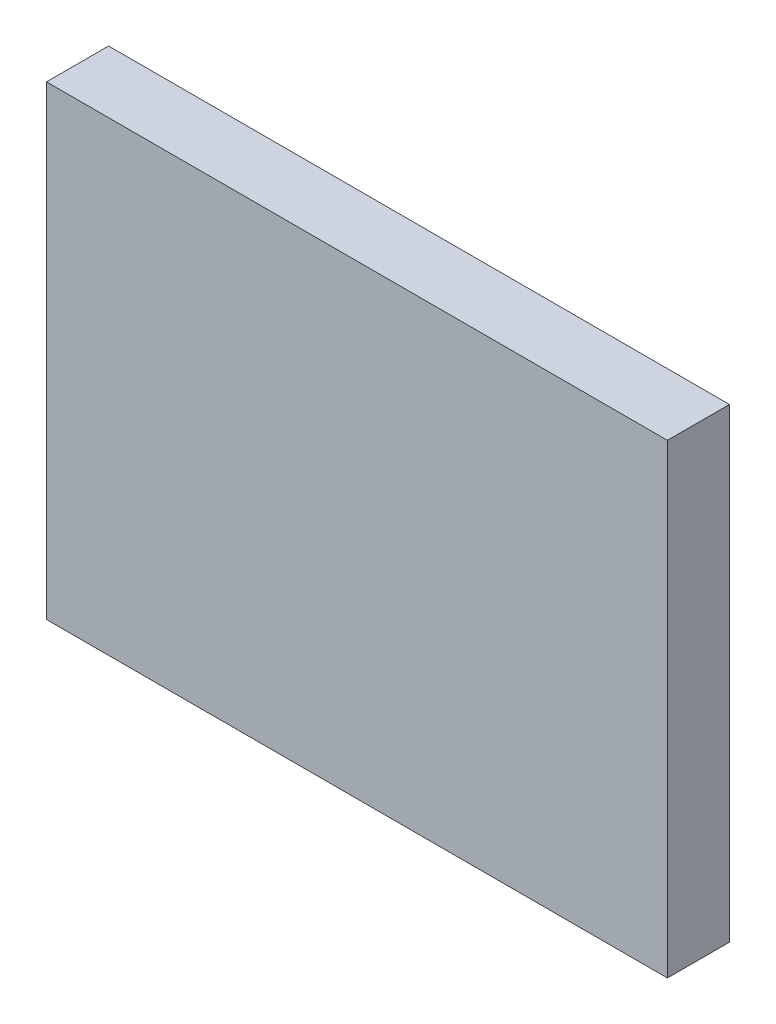
ISO-10303-21;
HEADER;
FILE_DESCRIPTION(('STEP AP214'),'2;1');
FILE_NAME('part.step','',(''),(''),'','','');
FILE_SCHEMA(('AUTOMOTIVE_DESIGN { 1 0 10303 214 1 1 1 1 }'));
ENDSEC;
DATA;
#1=APPLICATION_CONTEXT('core data for automotive mechanical design processes');
#2=APPLICATION_PROTOCOL_DEFINITION('international standard','automotive_design',2000,#1);
#3=PRODUCT_CONTEXT('',#1,'mechanical');
#4=PRODUCT('Part','Part','',(#3));
#5=PRODUCT_RELATED_PRODUCT_CATEGORY('part','',(#4));
#6=PRODUCT_DEFINITION_FORMATION('','',#4);
#7=PRODUCT_DEFINITION_CONTEXT('part definition',#1,'design');
#8=PRODUCT_DEFINITION('design','',#6,#7);
#9=PRODUCT_DEFINITION_SHAPE('','',#8);
#10=(LENGTH_UNIT() NAMED_UNIT(*) SI_UNIT(.MILLI.,.METRE.));
#11=(NAMED_UNIT(*) PLANE_ANGLE_UNIT() SI_UNIT($,.RADIAN.));
#12=(NAMED_UNIT(*) SI_UNIT($,.STERADIAN.) SOLID_ANGLE_UNIT());
#13=UNCERTAINTY_MEASURE_WITH_UNIT(LENGTH_MEASURE(1.E-05),#10,'distance_accuracy_value','');
#14=(GEOMETRIC_REPRESENTATION_CONTEXT(3) GLOBAL_UNCERTAINTY_ASSIGNED_CONTEXT((#13)) GLOBAL_UNIT_ASSIGNED_CONTEXT((#10,
#11,#12)) REPRESENTATION_CONTEXT('',''));
#15=CARTESIAN_POINT('',(0.,0.,0.));
#16=DIRECTION('',(0.,0.,1.));
#17=DIRECTION('',(1.,0.,0.));
#18=AXIS2_PLACEMENT_3D('',#15,#16,#17);
#19=CARTESIAN_POINT('',(-10.,-7.5,2.));
#20=DIRECTION('',(1.,0.,0.));
#21=DIRECTION('',(0.,0.,-1.));
#22=AXIS2_PLACEMENT_3D('',#19,#20,#21);
#23=PLANE('',#22);
#24=DIRECTION('',(0.,-1.,0.));
#25=VECTOR('',#24,1.);
#26=CARTESIAN_POINT('',(-10.,-7.5,0.));
#27=LINE('',#26,#25);
#28=CARTESIAN_POINT('',(-10.,7.5,0.));
#29=VERTEX_POINT('',#28);
#30=CARTESIAN_POINT('',(-10.,-7.5,0.));
#31=VERTEX_POINT('',#30);
#32=EDGE_CURVE('E95',#29,#31,#27,.T.);
#33=ORIENTED_EDGE('',*,*,#32,.T.);
#34=DIRECTION('',(0.,0.,-1.));
#35=VECTOR('',#34,1.);
#36=CARTESIAN_POINT('',(-10.,-7.5,2.));
#37=LINE('',#36,#35);
#38=CARTESIAN_POINT('',(-10.,-7.5,2.));
#39=VERTEX_POINT('',#38);
#40=EDGE_CURVE('E11',#39,#31,#37,.T.);
#41=ORIENTED_EDGE('',*,*,#40,.F.);
#42=DIRECTION('',(0.,-1.,0.));
#43=VECTOR('',#42,1.);
#44=CARTESIAN_POINT('',(-10.,-7.5,2.));
#45=LINE('',#44,#43);
#46=CARTESIAN_POINT('',(-10.,7.5,2.));
#47=VERTEX_POINT('',#46);
#48=EDGE_CURVE('E83',#47,#39,#45,.T.);
#49=ORIENTED_EDGE('',*,*,#48,.F.);
#50=DIRECTION('',(0.,0.,-1.));
#51=VECTOR('',#50,1.);
#52=CARTESIAN_POINT('',(-10.,7.5,2.));
#53=LINE('',#52,#51);
#54=EDGE_CURVE('E91',#47,#29,#53,.T.);
#55=ORIENTED_EDGE('',*,*,#54,.T.);
#56=EDGE_LOOP('',(#33,#41,#49,#55));
#57=FACE_BOUND('',#56,.T.);
#58=ADVANCED_FACE('F32',(#57),#23,.F.);
#59=CARTESIAN_POINT('',(10.,-7.5,2.));
#60=DIRECTION('',(0.,1.,0.));
#61=DIRECTION('',(-1.,0.,0.));
#62=AXIS2_PLACEMENT_3D('',#59,#60,#61);
#63=PLANE('',#62);
#64=DIRECTION('',(1.,0.,0.));
#65=VECTOR('',#64,1.);
#66=CARTESIAN_POINT('',(10.,-7.5,0.));
#67=LINE('',#66,#65);
#68=CARTESIAN_POINT('',(10.,-7.5,0.));
#69=VERTEX_POINT('',#68);
#70=EDGE_CURVE('E87',#31,#69,#67,.T.);
#71=ORIENTED_EDGE('',*,*,#70,.T.);
#72=DIRECTION('',(0.,0.,-1.));
#73=VECTOR('',#72,1.);
#74=CARTESIAN_POINT('',(10.,-7.5,2.));
#75=LINE('',#74,#73);
#76=CARTESIAN_POINT('',(10.,-7.5,2.));
#77=VERTEX_POINT('',#76);
#78=EDGE_CURVE('E40',#77,#69,#75,.T.);
#79=ORIENTED_EDGE('',*,*,#78,.F.);
#80=DIRECTION('',(1.,0.,0.));
#81=VECTOR('',#80,1.);
#82=CARTESIAN_POINT('',(10.,-7.5,2.));
#83=LINE('',#82,#81);
#84=EDGE_CURVE('E78',#39,#77,#83,.T.);
#85=ORIENTED_EDGE('',*,*,#84,.F.);
#86=ORIENTED_EDGE('',*,*,#40,.T.);
#87=EDGE_LOOP('',(#71,#79,#85,#86));
#88=FACE_BOUND('',#87,.T.);
#89=ADVANCED_FACE('F86',(#88),#63,.F.);
#90=CARTESIAN_POINT('',(10.,-7.5,2.));
#91=DIRECTION('',(-1.,0.,0.));
#92=DIRECTION('',(0.,0.,1.));
#93=AXIS2_PLACEMENT_3D('',#90,#91,#92);
#94=PLANE('',#93);
#95=DIRECTION('',(0.,1.,0.));
#96=VECTOR('',#95,1.);
#97=CARTESIAN_POINT('',(10.,-7.5,0.));
#98=LINE('',#97,#96);
#99=CARTESIAN_POINT('',(10.,7.5,0.));
#100=VERTEX_POINT('',#99);
#101=EDGE_CURVE('E65',#69,#100,#98,.T.);
#102=ORIENTED_EDGE('',*,*,#101,.T.);
#103=DIRECTION('',(0.,0.,-1.));
#104=VECTOR('',#103,1.);
#105=CARTESIAN_POINT('',(10.,7.5,2.));
#106=LINE('',#105,#104);
#107=CARTESIAN_POINT('',(10.,7.5,2.));
#108=VERTEX_POINT('',#107);
#109=EDGE_CURVE('E88',#108,#100,#106,.T.);
#110=ORIENTED_EDGE('',*,*,#109,.F.);
#111=DIRECTION('',(0.,1.,0.));
#112=VECTOR('',#111,1.);
#113=CARTESIAN_POINT('',(10.,-7.5,2.));
#114=LINE('',#113,#112);
#115=EDGE_CURVE('E81',#77,#108,#114,.T.);
#116=ORIENTED_EDGE('',*,*,#115,.F.);
#117=ORIENTED_EDGE('',*,*,#78,.T.);
#118=EDGE_LOOP('',(#102,#110,#116,#117));
#119=FACE_BOUND('',#118,.T.);
#120=ADVANCED_FACE('F89',(#119),#94,.F.);
#121=CARTESIAN_POINT('',(10.,7.5,2.));
#122=DIRECTION('',(0.,-1.,0.));
#123=DIRECTION('',(1.,0.,0.));
#124=AXIS2_PLACEMENT_3D('',#121,#122,#123);
#125=PLANE('',#124);
#126=DIRECTION('',(-1.,0.,0.));
#127=VECTOR('',#126,1.);
#128=CARTESIAN_POINT('',(10.,7.5,0.));
#129=LINE('',#128,#127);
#130=EDGE_CURVE('E71',#100,#29,#129,.T.);
#131=ORIENTED_EDGE('',*,*,#130,.T.);
#132=ORIENTED_EDGE('',*,*,#54,.F.);
#133=DIRECTION('',(-1.,0.,0.));
#134=VECTOR('',#133,1.);
#135=CARTESIAN_POINT('',(10.,7.5,2.));
#136=LINE('',#135,#134);
#137=EDGE_CURVE('E48',#108,#47,#136,.T.);
#138=ORIENTED_EDGE('',*,*,#137,.F.);
#139=ORIENTED_EDGE('',*,*,#109,.T.);
#140=EDGE_LOOP('',(#131,#132,#138,#139));
#141=FACE_BOUND('',#140,.T.);
#142=ADVANCED_FACE('F102',(#141),#125,.F.);
#143=CARTESIAN_POINT('',(0.,0.,2.));
#144=DIRECTION('',(0.,0.,1.));
#145=DIRECTION('',(1.,0.,0.));
#146=AXIS2_PLACEMENT_3D('',#143,#144,#145);
#147=PLANE('',#146);
#148=ORIENTED_EDGE('',*,*,#48,.T.);
#149=ORIENTED_EDGE('',*,*,#84,.T.);
#150=ORIENTED_EDGE('',*,*,#115,.T.);
#151=ORIENTED_EDGE('',*,*,#137,.T.);
#152=EDGE_LOOP('',(#148,#149,#150,#151));
#153=FACE_BOUND('',#152,.T.);
#154=ADVANCED_FACE('F79',(#153),#147,.T.);
#155=CARTESIAN_POINT('',(0.,0.,0.));
#156=DIRECTION('',(0.,0.,1.));
#157=DIRECTION('',(1.,0.,0.));
#158=AXIS2_PLACEMENT_3D('',#155,#156,#157);
#159=PLANE('',#158);
#160=ORIENTED_EDGE('',*,*,#32,.F.);
#161=ORIENTED_EDGE('',*,*,#130,.F.);
#162=ORIENTED_EDGE('',*,*,#101,.F.);
#163=ORIENTED_EDGE('',*,*,#70,.F.);
#164=EDGE_LOOP('',(#160,#161,#162,#163));
#165=FACE_BOUND('',#164,.T.);
#166=ADVANCED_FACE('F105',(#165),#159,.F.);
#167=CLOSED_SHELL('',(#58,#89,#120,#142,#154,#166));
#168=MANIFOLD_SOLID_BREP('B2',#167);
#169=ADVANCED_BREP_SHAPE_REPRESENTATION('',(#18,#168),#14);
#170=SHAPE_DEFINITION_REPRESENTATION(#9,#169);
ENDSEC;
END-ISO-10303-21;
